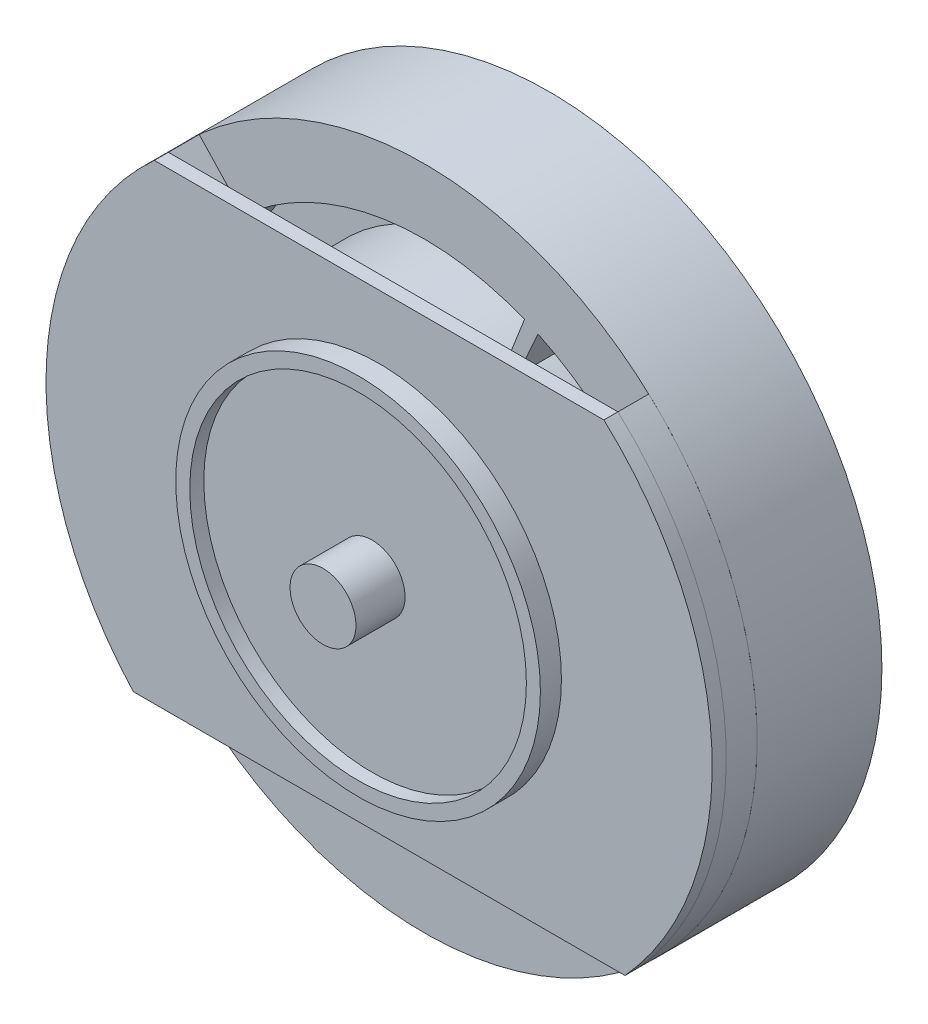
ISO-10303-21;
HEADER;
FILE_DESCRIPTION(('STEP AP214'),'2;1');
FILE_NAME('part.step','',(''),(''),'','','');
FILE_SCHEMA(('AUTOMOTIVE_DESIGN { 1 0 10303 214 1 1 1 1 }'));
ENDSEC;
DATA;
#1=APPLICATION_CONTEXT('core data for automotive mechanical design processes');
#2=APPLICATION_PROTOCOL_DEFINITION('international standard','automotive_design',2000,#1);
#3=PRODUCT_CONTEXT('',#1,'mechanical');
#4=PRODUCT('Part','Part','',(#3));
#5=PRODUCT_RELATED_PRODUCT_CATEGORY('part','',(#4));
#6=PRODUCT_DEFINITION_FORMATION('','',#4);
#7=PRODUCT_DEFINITION_CONTEXT('part definition',#1,'design');
#8=PRODUCT_DEFINITION('design','',#6,#7);
#9=PRODUCT_DEFINITION_SHAPE('','',#8);
#10=(LENGTH_UNIT() NAMED_UNIT(*) SI_UNIT(.MILLI.,.METRE.));
#11=(NAMED_UNIT(*) PLANE_ANGLE_UNIT() SI_UNIT($,.RADIAN.));
#12=(NAMED_UNIT(*) SI_UNIT($,.STERADIAN.) SOLID_ANGLE_UNIT());
#13=UNCERTAINTY_MEASURE_WITH_UNIT(LENGTH_MEASURE(1.E-05),#10,'distance_accuracy_value','');
#14=(GEOMETRIC_REPRESENTATION_CONTEXT(3) GLOBAL_UNCERTAINTY_ASSIGNED_CONTEXT((#13)) GLOBAL_UNIT_ASSIGNED_CONTEXT((#10,
#11,#12)) REPRESENTATION_CONTEXT('',''));
#15=CARTESIAN_POINT('',(0.,0.,0.));
#16=DIRECTION('',(0.,0.,1.));
#17=DIRECTION('',(1.,0.,0.));
#18=AXIS2_PLACEMENT_3D('',#15,#16,#17);
#19=CARTESIAN_POINT('',(-3.82843024285123,2.76033441316249,12.2448799994286));
#20=DIRECTION('',(0.,0.,-1.));
#21=DIRECTION('',(-1.,0.,0.));
#22=AXIS2_PLACEMENT_3D('',#19,#20,#21);
#23=CYLINDRICAL_SURFACE('',#22,23.75);
#24=CARTESIAN_POINT('',(-3.82843024285123,2.76033441316249,11.2448799994286));
#25=DIRECTION('',(0.,0.,1.));
#26=DIRECTION('',(1.,0.,0.));
#27=AXIS2_PLACEMENT_3D('',#24,#25,#26);
#28=CIRCLE('',#27,23.75);
#29=CARTESIAN_POINT('',(-19.8553375945632,20.2874773845552,11.2448799994286));
#30=VERTEX_POINT('',#29);
#31=CARTESIAN_POINT('',(-21.355573214244,-13.2665729385494,11.2448799994286));
#32=VERTEX_POINT('',#31);
#33=EDGE_CURVE('E128',#30,#32,#28,.T.);
#34=ORIENTED_EDGE('',*,*,#33,.T.);
#35=DIRECTION('',(0.,0.,-1.));
#36=VECTOR('',#35,1.);
#37=CARTESIAN_POINT('',(-21.355573214244,-13.2665729385494,12.2448799994286));
#38=LINE('',#37,#36);
#39=CARTESIAN_POINT('',(-21.355573214244,-13.2665729385494,12.2448799994286));
#40=VERTEX_POINT('',#39);
#41=EDGE_CURVE('E12',#40,#32,#38,.T.);
#42=ORIENTED_EDGE('',*,*,#41,.F.);
#43=CARTESIAN_POINT('',(-3.82843024285123,2.76033441316249,12.2448799994286));
#44=DIRECTION('',(0.,0.,1.));
#45=DIRECTION('',(1.,0.,0.));
#46=AXIS2_PLACEMENT_3D('',#43,#44,#45);
#47=CIRCLE('',#46,23.75);
#48=CARTESIAN_POINT('',(-19.8553375945632,20.2874773845552,12.2448799994286));
#49=VERTEX_POINT('',#48);
#50=EDGE_CURVE('E111',#49,#40,#47,.T.);
#51=ORIENTED_EDGE('',*,*,#50,.F.);
#52=DIRECTION('',(0.,0.,-1.));
#53=VECTOR('',#52,1.);
#54=CARTESIAN_POINT('',(-19.8553375945632,20.2874773845552,12.2448799994286));
#55=LINE('',#54,#53);
#56=EDGE_CURVE('E124',#49,#30,#55,.T.);
#57=ORIENTED_EDGE('',*,*,#56,.T.);
#58=EDGE_LOOP('',(#34,#42,#51,#57));
#59=FACE_BOUND('',#58,.T.);
#60=ADVANCED_FACE('F58',(#59),#23,.T.);
#61=CARTESIAN_POINT('',(-21.355573214244,-13.2665729385494,12.2448799994286));
#62=DIRECTION('',(0.,1.,0.));
#63=DIRECTION('',(0.,0.,1.));
#64=AXIS2_PLACEMENT_3D('',#61,#62,#63);
#65=PLANE('',#64);
#66=DIRECTION('',(1.,0.,0.));
#67=VECTOR('',#66,1.);
#68=CARTESIAN_POINT('',(-21.355573214244,-13.2665729385494,11.2448799994286));
#69=LINE('',#68,#67);
#70=CARTESIAN_POINT('',(13.6987127285415,-13.2665729385494,11.2448799994286));
#71=VERTEX_POINT('',#70);
#72=EDGE_CURVE('E116',#32,#71,#69,.T.);
#73=ORIENTED_EDGE('',*,*,#72,.T.);
#74=DIRECTION('',(0.,0.,-1.));
#75=VECTOR('',#74,1.);
#76=CARTESIAN_POINT('',(13.6987127285415,-13.2665729385494,12.2448799994286));
#77=LINE('',#76,#75);
#78=CARTESIAN_POINT('',(13.6987127285415,-13.2665729385494,12.2448799994286));
#79=VERTEX_POINT('',#78);
#80=EDGE_CURVE('E68',#79,#71,#77,.T.);
#81=ORIENTED_EDGE('',*,*,#80,.F.);
#82=DIRECTION('',(1.,0.,0.));
#83=VECTOR('',#82,1.);
#84=CARTESIAN_POINT('',(-21.355573214244,-13.2665729385494,12.2448799994286));
#85=LINE('',#84,#83);
#86=EDGE_CURVE('E106',#40,#79,#85,.T.);
#87=ORIENTED_EDGE('',*,*,#86,.F.);
#88=ORIENTED_EDGE('',*,*,#41,.T.);
#89=EDGE_LOOP('',(#73,#81,#87,#88));
#90=FACE_BOUND('',#89,.T.);
#91=ADVANCED_FACE('F115',(#90),#65,.F.);
#92=CARTESIAN_POINT('',(-3.82843024285123,2.76033441316249,12.2448799994286));
#93=DIRECTION('',(0.,0.,-1.));
#94=DIRECTION('',(-1.,0.,0.));
#95=AXIS2_PLACEMENT_3D('',#92,#93,#94);
#96=CYLINDRICAL_SURFACE('',#95,23.75);
#97=CARTESIAN_POINT('',(-3.82843024285123,2.76033441316249,11.2448799994286));
#98=DIRECTION('',(0.,0.,1.));
#99=DIRECTION('',(-1.,0.,0.));
#100=AXIS2_PLACEMENT_3D('',#97,#98,#99);
#101=CIRCLE('',#100,23.75);
#102=CARTESIAN_POINT('',(12.1984771088607,20.2874773845552,11.2448799994286));
#103=VERTEX_POINT('',#102);
#104=EDGE_CURVE('E93',#71,#103,#101,.T.);
#105=ORIENTED_EDGE('',*,*,#104,.T.);
#106=DIRECTION('',(0.,0.,-1.));
#107=VECTOR('',#106,1.);
#108=CARTESIAN_POINT('',(12.1984771088607,20.2874773845552,12.2448799994286));
#109=LINE('',#108,#107);
#110=CARTESIAN_POINT('',(12.1984771088607,20.2874773845552,12.2448799994286));
#111=VERTEX_POINT('',#110);
#112=EDGE_CURVE('E118',#111,#103,#109,.T.);
#113=ORIENTED_EDGE('',*,*,#112,.F.);
#114=CARTESIAN_POINT('',(-3.82843024285123,2.76033441316249,12.2448799994286));
#115=DIRECTION('',(0.,0.,1.));
#116=DIRECTION('',(-1.,0.,0.));
#117=AXIS2_PLACEMENT_3D('',#114,#115,#116);
#118=CIRCLE('',#117,23.75);
#119=EDGE_CURVE('E109',#79,#111,#118,.T.);
#120=ORIENTED_EDGE('',*,*,#119,.F.);
#121=ORIENTED_EDGE('',*,*,#80,.T.);
#122=EDGE_LOOP('',(#105,#113,#120,#121));
#123=FACE_BOUND('',#122,.T.);
#124=ADVANCED_FACE('F120',(#123),#96,.T.);
#125=CARTESIAN_POINT('',(-19.8553375945632,20.2874773845552,12.2448799994286));
#126=DIRECTION('',(0.,-1.,0.));
#127=DIRECTION('',(0.,0.,-1.));
#128=AXIS2_PLACEMENT_3D('',#125,#126,#127);
#129=PLANE('',#128);
#130=DIRECTION('',(-1.,0.,0.));
#131=VECTOR('',#130,1.);
#132=CARTESIAN_POINT('',(-19.8553375945632,20.2874773845552,11.2448799994286));
#133=LINE('',#132,#131);
#134=EDGE_CURVE('E99',#103,#30,#133,.T.);
#135=ORIENTED_EDGE('',*,*,#134,.T.);
#136=ORIENTED_EDGE('',*,*,#56,.F.);
#137=DIRECTION('',(-1.,0.,0.));
#138=VECTOR('',#137,1.);
#139=CARTESIAN_POINT('',(-19.8553375945632,20.2874773845552,12.2448799994286));
#140=LINE('',#139,#138);
#141=EDGE_CURVE('E76',#111,#49,#140,.T.);
#142=ORIENTED_EDGE('',*,*,#141,.F.);
#143=ORIENTED_EDGE('',*,*,#112,.T.);
#144=EDGE_LOOP('',(#135,#136,#142,#143));
#145=FACE_BOUND('',#144,.T.);
#146=ADVANCED_FACE('F142',(#145),#129,.F.);
#147=CARTESIAN_POINT('',(-3.82843024285123,2.76033441316249,12.2448799994286));
#148=DIRECTION('',(0.,0.,1.));
#149=DIRECTION('',(1.,0.,0.));
#150=AXIS2_PLACEMENT_3D('',#147,#148,#149);
#151=PLANE('',#150);
#152=CARTESIAN_POINT('',(-3.82843024285123,2.76033441316249,12.2448799994286));
#153=DIRECTION('',(0.,0.,1.));
#154=DIRECTION('',(1.,0.,0.));
#155=AXIS2_PLACEMENT_3D('',#152,#153,#154);
#156=CIRCLE('',#155,13.);
#157=CARTESIAN_POINT('',(9.17156975714877,2.76033441316249,12.2448799994286));
#158=VERTEX_POINT('',#157);
#159=EDGE_CURVE('E152',#158,#158,#156,.T.);
#160=ORIENTED_EDGE('',*,*,#159,.F.);
#161=EDGE_LOOP('',(#160));
#162=FACE_BOUND('',#161,.T.);
#163=ORIENTED_EDGE('',*,*,#50,.T.);
#164=ORIENTED_EDGE('',*,*,#86,.T.);
#165=ORIENTED_EDGE('',*,*,#119,.T.);
#166=ORIENTED_EDGE('',*,*,#141,.T.);
#167=EDGE_LOOP('',(#163,#164,#165,#166));
#168=FACE_BOUND('',#167,.T.);
#169=ADVANCED_FACE('F107',(#162,#168),#151,.T.);
#170=CARTESIAN_POINT('',(-3.82843024285123,2.76033441316249,11.2448799994286));
#171=DIRECTION('',(0.,0.,1.));
#172=DIRECTION('',(1.,0.,0.));
#173=AXIS2_PLACEMENT_3D('',#170,#171,#172);
#174=PLANE('',#173);
#175=ORIENTED_EDGE('',*,*,#33,.F.);
#176=ORIENTED_EDGE('',*,*,#134,.F.);
#177=ORIENTED_EDGE('',*,*,#104,.F.);
#178=ORIENTED_EDGE('',*,*,#72,.F.);
#179=EDGE_LOOP('',(#175,#176,#177,#178));
#180=FACE_BOUND('',#179,.T.);
#181=ADVANCED_FACE('F145',(#180),#174,.F.);
#182=CARTESIAN_POINT('',(-3.82843024285123,2.76033441316249,13.7448799994286));
#183=DIRECTION('',(0.,0.,-1.));
#184=DIRECTION('',(-1.,0.,0.));
#185=AXIS2_PLACEMENT_3D('',#182,#183,#184);
#186=CYLINDRICAL_SURFACE('',#185,13.);
#187=CARTESIAN_POINT('',(-3.82843024285123,2.76033441316249,13.7448799994286));
#188=DIRECTION('',(0.,0.,1.));
#189=DIRECTION('',(1.,0.,0.));
#190=AXIS2_PLACEMENT_3D('',#187,#188,#189);
#191=CIRCLE('',#190,13.);
#192=CARTESIAN_POINT('',(9.17156975714877,2.76033441316249,13.7448799994286));
#193=VERTEX_POINT('',#192);
#194=EDGE_CURVE('E156',#193,#193,#191,.T.);
#195=ORIENTED_EDGE('',*,*,#194,.F.);
#196=EDGE_LOOP('',(#195));
#197=FACE_BOUND('',#196,.T.);
#198=ORIENTED_EDGE('',*,*,#159,.T.);
#199=EDGE_LOOP('',(#198));
#200=FACE_BOUND('',#199,.T.);
#201=ADVANCED_FACE('F180',(#197,#200),#186,.T.);
#202=CARTESIAN_POINT('',(-3.82843024285123,2.76033441316249,13.7448799994286));
#203=DIRECTION('',(0.,0.,1.));
#204=DIRECTION('',(1.,0.,0.));
#205=AXIS2_PLACEMENT_3D('',#202,#203,#204);
#206=PLANE('',#205);
#207=CARTESIAN_POINT('',(-3.82843024285123,2.76033441316249,13.7448799994286));
#208=DIRECTION('',(0.,0.,1.));
#209=DIRECTION('',(1.,0.,0.));
#210=AXIS2_PLACEMENT_3D('',#207,#208,#209);
#211=CIRCLE('',#210,12.);
#212=CARTESIAN_POINT('',(8.17156975714877,2.76033441316249,13.7448799994286));
#213=VERTEX_POINT('',#212);
#214=EDGE_CURVE('E161',#213,#213,#211,.T.);
#215=ORIENTED_EDGE('',*,*,#214,.F.);
#216=EDGE_LOOP('',(#215));
#217=FACE_BOUND('',#216,.T.);
#218=ORIENTED_EDGE('',*,*,#194,.T.);
#219=EDGE_LOOP('',(#218));
#220=FACE_BOUND('',#219,.T.);
#221=ADVANCED_FACE('F174',(#217,#220),#206,.T.);
#222=CARTESIAN_POINT('',(-3.82843024285123,2.76033441316249,12.7448799994286));
#223=DIRECTION('',(0.,0.,1.));
#224=DIRECTION('',(1.,0.,0.));
#225=AXIS2_PLACEMENT_3D('',#222,#223,#224);
#226=CYLINDRICAL_SURFACE('',#225,12.);
#227=CARTESIAN_POINT('',(-3.82843024285123,2.76033441316249,12.7448799994286));
#228=DIRECTION('',(0.,0.,1.));
#229=DIRECTION('',(1.,0.,0.));
#230=AXIS2_PLACEMENT_3D('',#227,#228,#229);
#231=CIRCLE('',#230,12.);
#232=CARTESIAN_POINT('',(8.17156975714877,2.76033441316249,12.7448799994286));
#233=VERTEX_POINT('',#232);
#234=EDGE_CURVE('E157',#233,#233,#231,.T.);
#235=ORIENTED_EDGE('',*,*,#234,.F.);
#236=EDGE_LOOP('',(#235));
#237=FACE_BOUND('',#236,.T.);
#238=ORIENTED_EDGE('',*,*,#214,.T.);
#239=EDGE_LOOP('',(#238));
#240=FACE_BOUND('',#239,.T.);
#241=ADVANCED_FACE('F171',(#237,#240),#226,.F.);
#242=CARTESIAN_POINT('',(-3.82843024285123,2.76033441316249,12.7448799994286));
#243=DIRECTION('',(0.,0.,1.));
#244=DIRECTION('',(1.,0.,0.));
#245=AXIS2_PLACEMENT_3D('',#242,#243,#244);
#246=PLANE('',#245);
#247=CARTESIAN_POINT('',(-3.82843024285123,2.76033441316249,12.7448799994286));
#248=DIRECTION('',(0.,0.,1.));
#249=DIRECTION('',(1.,0.,0.));
#250=AXIS2_PLACEMENT_3D('',#247,#248,#249);
#251=CIRCLE('',#250,2.35);
#252=CARTESIAN_POINT('',(-1.47843024285123,2.76033441316249,12.7448799994286));
#253=VERTEX_POINT('',#252);
#254=EDGE_CURVE('E61',#253,#253,#251,.T.);
#255=ORIENTED_EDGE('',*,*,#254,.F.);
#256=EDGE_LOOP('',(#255));
#257=FACE_BOUND('',#256,.T.);
#258=ORIENTED_EDGE('',*,*,#234,.T.);
#259=EDGE_LOOP('',(#258));
#260=FACE_BOUND('',#259,.T.);
#261=ADVANCED_FACE('F169',(#257,#260),#246,.T.);
#262=CARTESIAN_POINT('',(-3.82843024285123,2.76033441316249,16.2448799994286));
#263=DIRECTION('',(0.,0.,1.));
#264=DIRECTION('',(1.,0.,0.));
#265=AXIS2_PLACEMENT_3D('',#262,#263,#264);
#266=PLANE('',#265);
#267=CARTESIAN_POINT('',(-3.82843024285123,2.76033441316249,16.2448799994286));
#268=DIRECTION('',(0.,0.,1.));
#269=DIRECTION('',(1.,0.,0.));
#270=AXIS2_PLACEMENT_3D('',#267,#268,#269);
#271=CIRCLE('',#270,2.35);
#272=CARTESIAN_POINT('',(-1.47843024285123,2.76033441316249,16.2448799994286));
#273=VERTEX_POINT('',#272);
#274=EDGE_CURVE('E132',#273,#273,#271,.T.);
#275=ORIENTED_EDGE('',*,*,#274,.T.);
#276=EDGE_LOOP('',(#275));
#277=FACE_BOUND('',#276,.T.);
#278=ADVANCED_FACE('F252',(#277),#266,.T.);
#279=CARTESIAN_POINT('',(-3.82843024285123,2.76033441316249,16.2448799994286));
#280=DIRECTION('',(0.,0.,-1.));
#281=DIRECTION('',(-1.,0.,0.));
#282=AXIS2_PLACEMENT_3D('',#279,#280,#281);
#283=CYLINDRICAL_SURFACE('',#282,2.35);
#284=ORIENTED_EDGE('',*,*,#254,.T.);
#285=EDGE_LOOP('',(#284));
#286=FACE_BOUND('',#285,.T.);
#287=ORIENTED_EDGE('',*,*,#274,.F.);
#288=EDGE_LOOP('',(#287));
#289=FACE_BOUND('',#288,.T.);
#290=ADVANCED_FACE('F263',(#286,#289),#283,.T.);
#291=CLOSED_SHELL('',(#60,#91,#124,#146,#169,#181,#201,#221,#241,#261,#278,#290));
#292=MANIFOLD_SOLID_BREP('B2',#291);
#293=CARTESIAN_POINT('',(-3.82843024285123,2.76033441316249,9.04487999942864));
#294=DIRECTION('',(0.,0.,1.));
#295=DIRECTION('',(1.,0.,0.));
#296=AXIS2_PLACEMENT_3D('',#293,#294,#295);
#297=PLANE('',#296);
#298=CARTESIAN_POINT('',(-3.82843024285123,2.76033441316249,9.04487999942864));
#299=DIRECTION('',(0.,0.,-1.));
#300=DIRECTION('',(1.,0.,0.));
#301=AXIS2_PLACEMENT_3D('',#298,#299,#300);
#302=CIRCLE('',#301,19.1);
#303=CARTESIAN_POINT('',(-17.9579810626889,-10.0913500534599,9.04487999942864));
#304=VERTEX_POINT('',#303);
#305=CARTESIAN_POINT('',(-16.6801147094736,16.8898852330002,9.04487999942864));
#306=VERTEX_POINT('',#305);
#307=EDGE_CURVE('E56',#304,#306,#302,.T.);
#308=ORIENTED_EDGE('',*,*,#307,.F.);
#309=DIRECTION('',(0.730611377314205,0.682793537856825,0.));
#310=VECTOR('',#309,1.);
#311=CARTESIAN_POINT('',(-21.355573214244,-13.2665729385494,9.04487999942864));
#312=LINE('',#311,#310);
#313=CARTESIAN_POINT('',(-21.355573214244,-13.2665729385494,9.04487999942864));
#314=VERTEX_POINT('',#313);
#315=EDGE_CURVE('E387',#314,#304,#312,.T.);
#316=ORIENTED_EDGE('',*,*,#315,.F.);
#317=CARTESIAN_POINT('',(-3.82843024285123,2.76033441316249,9.04487999942864));
#318=DIRECTION('',(0.,0.,1.));
#319=DIRECTION('',(1.,0.,0.));
#320=AXIS2_PLACEMENT_3D('',#317,#318,#319);
#321=CIRCLE('',#320,23.75);
#322=CARTESIAN_POINT('',(-19.8553375945632,20.2874773845552,9.04487999942864));
#323=VERTEX_POINT('',#322);
#324=EDGE_CURVE('E390',#323,#314,#321,.T.);
#325=ORIENTED_EDGE('',*,*,#324,.F.);
#326=DIRECTION('',(-0.682793537856825,0.730611377314205,0.));
#327=VECTOR('',#326,1.);
#328=CARTESIAN_POINT('',(-16.6801147094736,16.8898852330002,9.04487999942864));
#329=LINE('',#328,#327);
#330=EDGE_CURVE('E333',#306,#323,#329,.T.);
#331=ORIENTED_EDGE('',*,*,#330,.F.);
#332=EDGE_LOOP('',(#308,#316,#325,#331));
#333=FACE_BOUND('',#332,.T.);
#334=ADVANCED_FACE('F324',(#333),#297,.F.);
#335=CARTESIAN_POINT('',(-21.355573214244,-13.2665729385494,47.2244431281084));
#336=DIRECTION('',(-0.682793537856825,0.730611377314205,0.));
#337=DIRECTION('',(-0.730611377314205,-0.682793537856825,0.));
#338=AXIS2_PLACEMENT_3D('',#335,#336,#337);
#339=PLANE('',#338);
#340=DIRECTION('',(0.,0.,-1.));
#341=VECTOR('',#340,1.);
#342=CARTESIAN_POINT('',(-17.9579810626889,-10.0913500534599,47.2244431281084));
#343=LINE('',#342,#341);
#344=CARTESIAN_POINT('',(-17.9579810626889,-10.0913500534599,11.2448799994286));
#345=VERTEX_POINT('',#344);
#346=EDGE_CURVE('E385',#345,#304,#343,.T.);
#347=ORIENTED_EDGE('',*,*,#346,.F.);
#348=DIRECTION('',(-0.730611377314205,-0.682793537856825,0.));
#349=VECTOR('',#348,1.);
#350=CARTESIAN_POINT('',(-21.355573214244,-13.2665729385494,11.2448799994286));
#351=LINE('',#350,#349);
#352=CARTESIAN_POINT('',(-21.355573214244,-13.2665729385494,11.2448799994286));
#353=VERTEX_POINT('',#352);
#354=EDGE_CURVE('E378',#345,#353,#351,.T.);
#355=ORIENTED_EDGE('',*,*,#354,.T.);
#356=DIRECTION('',(0.,0.,-1.));
#357=VECTOR('',#356,1.);
#358=CARTESIAN_POINT('',(-21.355573214244,-13.2665729385494,47.2244431281084));
#359=LINE('',#358,#357);
#360=EDGE_CURVE('E374',#353,#314,#359,.T.);
#361=ORIENTED_EDGE('',*,*,#360,.T.);
#362=ORIENTED_EDGE('',*,*,#315,.T.);
#363=EDGE_LOOP('',(#347,#355,#361,#362));
#364=FACE_BOUND('',#363,.T.);
#365=ADVANCED_FACE('F395',(#364),#339,.F.);
#366=CARTESIAN_POINT('',(-3.82843024285123,2.76033441316249,47.2244431281084));
#367=DIRECTION('',(0.,0.,-1.));
#368=DIRECTION('',(-1.,0.,0.));
#369=AXIS2_PLACEMENT_3D('',#366,#367,#368);
#370=CYLINDRICAL_SURFACE('',#369,23.75);
#371=ORIENTED_EDGE('',*,*,#360,.F.);
#372=CARTESIAN_POINT('',(-3.82843024285123,2.76033441316249,11.2448799994286));
#373=DIRECTION('',(0.,0.,-1.));
#374=DIRECTION('',(-1.,0.,0.));
#375=AXIS2_PLACEMENT_3D('',#372,#373,#374);
#376=CIRCLE('',#375,23.75);
#377=CARTESIAN_POINT('',(-19.8553375945632,20.2874773845552,11.2448799994286));
#378=VERTEX_POINT('',#377);
#379=EDGE_CURVE('E328',#353,#378,#376,.T.);
#380=ORIENTED_EDGE('',*,*,#379,.T.);
#381=DIRECTION('',(0.,0.,-1.));
#382=VECTOR('',#381,1.);
#383=CARTESIAN_POINT('',(-19.8553375945632,20.2874773845552,47.2244431281084));
#384=LINE('',#383,#382);
#385=EDGE_CURVE('E349',#378,#323,#384,.T.);
#386=ORIENTED_EDGE('',*,*,#385,.T.);
#387=ORIENTED_EDGE('',*,*,#324,.T.);
#388=EDGE_LOOP('',(#371,#380,#386,#387));
#389=FACE_BOUND('',#388,.T.);
#390=ADVANCED_FACE('F376',(#389),#370,.T.);
#391=CARTESIAN_POINT('',(-16.6801147094736,16.8898852330002,47.2244431281084));
#392=DIRECTION('',(-0.730611377314205,-0.682793537856825,0.));
#393=DIRECTION('',(0.682793537856825,-0.730611377314205,0.));
#394=AXIS2_PLACEMENT_3D('',#391,#392,#393);
#395=PLANE('',#394);
#396=ORIENTED_EDGE('',*,*,#385,.F.);
#397=DIRECTION('',(0.682793537856825,-0.730611377314205,0.));
#398=VECTOR('',#397,1.);
#399=CARTESIAN_POINT('',(-16.6801147094736,16.8898852330002,11.2448799994286));
#400=LINE('',#399,#398);
#401=CARTESIAN_POINT('',(-16.6801147094736,16.8898852330002,11.2448799994286));
#402=VERTEX_POINT('',#401);
#403=EDGE_CURVE('E368',#378,#402,#400,.T.);
#404=ORIENTED_EDGE('',*,*,#403,.T.);
#405=DIRECTION('',(0.,0.,-1.));
#406=VECTOR('',#405,1.);
#407=CARTESIAN_POINT('',(-16.6801147094736,16.8898852330002,47.2244431281084));
#408=LINE('',#407,#406);
#409=EDGE_CURVE('E341',#402,#306,#408,.T.);
#410=ORIENTED_EDGE('',*,*,#409,.T.);
#411=ORIENTED_EDGE('',*,*,#330,.T.);
#412=EDGE_LOOP('',(#396,#404,#410,#411));
#413=FACE_BOUND('',#412,.T.);
#414=ADVANCED_FACE('F372',(#413),#395,.F.);
#415=CARTESIAN_POINT('',(-3.82843024285123,2.76033441316249,47.2244431281084));
#416=DIRECTION('',(0.,0.,-1.));
#417=DIRECTION('',(-1.,0.,0.));
#418=AXIS2_PLACEMENT_3D('',#415,#416,#417);
#419=CYLINDRICAL_SURFACE('',#418,19.1);
#420=ORIENTED_EDGE('',*,*,#409,.F.);
#421=CARTESIAN_POINT('',(-3.82843024285123,2.76033441316249,11.2448799994286));
#422=DIRECTION('',(0.,0.,-1.));
#423=DIRECTION('',(-1.,0.,0.));
#424=AXIS2_PLACEMENT_3D('',#421,#422,#423);
#425=CIRCLE('',#424,19.1);
#426=EDGE_CURVE('E371',#402,#345,#425,.F.);
#427=ORIENTED_EDGE('',*,*,#426,.T.);
#428=ORIENTED_EDGE('',*,*,#346,.T.);
#429=ORIENTED_EDGE('',*,*,#307,.T.);
#430=EDGE_LOOP('',(#420,#427,#428,#429));
#431=FACE_BOUND('',#430,.T.);
#432=ADVANCED_FACE('F394',(#431),#419,.F.);
#433=CARTESIAN_POINT('',(-3.82843024285123,2.76033441316249,11.2448799994286));
#434=DIRECTION('',(0.,0.,-1.));
#435=DIRECTION('',(-1.,0.,0.));
#436=AXIS2_PLACEMENT_3D('',#433,#434,#435);
#437=PLANE('',#436);
#438=ORIENTED_EDGE('',*,*,#403,.F.);
#439=ORIENTED_EDGE('',*,*,#379,.F.);
#440=ORIENTED_EDGE('',*,*,#354,.F.);
#441=ORIENTED_EDGE('',*,*,#426,.F.);
#442=EDGE_LOOP('',(#438,#439,#440,#441));
#443=FACE_BOUND('',#442,.T.);
#444=ADVANCED_FACE('F326',(#443),#437,.F.);
#445=CLOSED_SHELL('',(#334,#365,#390,#414,#432,#444));
#446=MANIFOLD_SOLID_BREP('B6',#445);
#447=CARTESIAN_POINT('',(-3.82843024285123,2.76033441316249,9.04487999942864));
#448=DIRECTION('',(0.,0.,-1.));
#449=DIRECTION('',(-1.,0.,0.));
#450=AXIS2_PLACEMENT_3D('',#447,#448,#449);
#451=PLANE('',#450);
#452=CARTESIAN_POINT('',(-3.82843024285123,2.76033441316249,9.04487999942864));
#453=DIRECTION('',(0.,0.,-1.));
#454=DIRECTION('',(-1.,0.,0.));
#455=AXIS2_PLACEMENT_3D('',#452,#453,#454);
#456=CIRCLE('',#455,19.1);
#457=CARTESIAN_POINT('',(9.02325422377115,16.8898852330002,9.04487999942864));
#458=VERTEX_POINT('',#457);
#459=CARTESIAN_POINT('',(10.3011205769865,-10.0913500534599,9.04487999942864));
#460=VERTEX_POINT('',#459);
#461=EDGE_CURVE('E520',#458,#460,#456,.T.);
#462=ORIENTED_EDGE('',*,*,#461,.F.);
#463=DIRECTION('',(-0.682793537856827,-0.730611377314204,0.));
#464=VECTOR('',#463,1.);
#465=CARTESIAN_POINT('',(9.02325422377115,16.8898852330002,9.04487999942864));
#466=LINE('',#465,#464);
#467=CARTESIAN_POINT('',(12.1984771088607,20.2874773845552,9.04487999942864));
#468=VERTEX_POINT('',#467);
#469=EDGE_CURVE('E531',#468,#458,#466,.T.);
#470=ORIENTED_EDGE('',*,*,#469,.F.);
#471=CARTESIAN_POINT('',(-3.82843024285123,2.76033441316249,9.04487999942864));
#472=DIRECTION('',(0.,0.,1.));
#473=DIRECTION('',(1.,0.,0.));
#474=AXIS2_PLACEMENT_3D('',#471,#472,#473);
#475=CIRCLE('',#474,23.75);
#476=CARTESIAN_POINT('',(13.6987127285415,-13.2665729385494,9.04487999942864));
#477=VERTEX_POINT('',#476);
#478=EDGE_CURVE('E522',#477,#468,#475,.T.);
#479=ORIENTED_EDGE('',*,*,#478,.F.);
#480=DIRECTION('',(0.730611377314204,-0.682793537856827,0.));
#481=VECTOR('',#480,1.);
#482=CARTESIAN_POINT('',(13.6987127285415,-13.2665729385494,9.04487999942864));
#483=LINE('',#482,#481);
#484=EDGE_CURVE('E512',#460,#477,#483,.T.);
#485=ORIENTED_EDGE('',*,*,#484,.F.);
#486=EDGE_LOOP('',(#462,#470,#479,#485));
#487=FACE_BOUND('',#486,.T.);
#488=ADVANCED_FACE('F470',(#487),#451,.T.);
#489=CARTESIAN_POINT('',(9.02325422377115,16.8898852330002,47.2244431281084));
#490=DIRECTION('',(0.730611377314204,-0.682793537856827,0.));
#491=DIRECTION('',(0.682793537856827,0.730611377314204,0.));
#492=AXIS2_PLACEMENT_3D('',#489,#490,#491);
#493=PLANE('',#492);
#494=DIRECTION('',(0.,0.,-1.));
#495=VECTOR('',#494,1.);
#496=CARTESIAN_POINT('',(9.02325422377115,16.8898852330002,47.2244431281084));
#497=LINE('',#496,#495);
#498=CARTESIAN_POINT('',(9.02325422377115,16.8898852330002,11.2448799994286));
#499=VERTEX_POINT('',#498);
#500=EDGE_CURVE('E525',#499,#458,#497,.T.);
#501=ORIENTED_EDGE('',*,*,#500,.F.);
#502=DIRECTION('',(0.682793537856827,0.730611377314204,0.));
#503=VECTOR('',#502,1.);
#504=CARTESIAN_POINT('',(9.02325422377115,16.8898852330002,11.2448799994286));
#505=LINE('',#504,#503);
#506=CARTESIAN_POINT('',(12.1984771088607,20.2874773845552,11.2448799994286));
#507=VERTEX_POINT('',#506);
#508=EDGE_CURVE('E474',#499,#507,#505,.T.);
#509=ORIENTED_EDGE('',*,*,#508,.T.);
#510=DIRECTION('',(0.,0.,-1.));
#511=VECTOR('',#510,1.);
#512=CARTESIAN_POINT('',(12.1984771088607,20.2874773845552,47.2244431281084));
#513=LINE('',#512,#511);
#514=EDGE_CURVE('E534',#507,#468,#513,.T.);
#515=ORIENTED_EDGE('',*,*,#514,.T.);
#516=ORIENTED_EDGE('',*,*,#469,.T.);
#517=EDGE_LOOP('',(#501,#509,#515,#516));
#518=FACE_BOUND('',#517,.T.);
#519=ADVANCED_FACE('F543',(#518),#493,.F.);
#520=CARTESIAN_POINT('',(-3.82843024285123,2.76033441316249,47.2244431281084));
#521=DIRECTION('',(0.,0.,-1.));
#522=DIRECTION('',(-1.,0.,0.));
#523=AXIS2_PLACEMENT_3D('',#520,#521,#522);
#524=CYLINDRICAL_SURFACE('',#523,23.75);
#525=ORIENTED_EDGE('',*,*,#514,.F.);
#526=CARTESIAN_POINT('',(-3.82843024285123,2.76033441316249,11.2448799994286));
#527=DIRECTION('',(0.,0.,-1.));
#528=DIRECTION('',(-1.,0.,0.));
#529=AXIS2_PLACEMENT_3D('',#526,#527,#528);
#530=CIRCLE('',#529,23.75);
#531=CARTESIAN_POINT('',(13.6987127285415,-13.2665729385494,11.2448799994286));
#532=VERTEX_POINT('',#531);
#533=EDGE_CURVE('E540',#507,#532,#530,.T.);
#534=ORIENTED_EDGE('',*,*,#533,.T.);
#535=DIRECTION('',(0.,0.,-1.));
#536=VECTOR('',#535,1.);
#537=CARTESIAN_POINT('',(13.6987127285415,-13.2665729385494,47.2244431281084));
#538=LINE('',#537,#536);
#539=EDGE_CURVE('E516',#532,#477,#538,.T.);
#540=ORIENTED_EDGE('',*,*,#539,.T.);
#541=ORIENTED_EDGE('',*,*,#478,.T.);
#542=EDGE_LOOP('',(#525,#534,#540,#541));
#543=FACE_BOUND('',#542,.T.);
#544=ADVANCED_FACE('F539',(#543),#524,.T.);
#545=CARTESIAN_POINT('',(13.6987127285415,-13.2665729385494,47.2244431281084));
#546=DIRECTION('',(0.682793537856827,0.730611377314204,0.));
#547=DIRECTION('',(-0.730611377314204,0.682793537856827,0.));
#548=AXIS2_PLACEMENT_3D('',#545,#546,#547);
#549=PLANE('',#548);
#550=ORIENTED_EDGE('',*,*,#539,.F.);
#551=DIRECTION('',(-0.730611377314204,0.682793537856827,0.));
#552=VECTOR('',#551,1.);
#553=CARTESIAN_POINT('',(13.6987127285415,-13.2665729385494,11.2448799994286));
#554=LINE('',#553,#552);
#555=CARTESIAN_POINT('',(10.3011205769865,-10.0913500534599,11.2448799994286));
#556=VERTEX_POINT('',#555);
#557=EDGE_CURVE('E479',#532,#556,#554,.T.);
#558=ORIENTED_EDGE('',*,*,#557,.T.);
#559=DIRECTION('',(0.,0.,-1.));
#560=VECTOR('',#559,1.);
#561=CARTESIAN_POINT('',(10.3011205769865,-10.0913500534599,47.2244431281084));
#562=LINE('',#561,#560);
#563=EDGE_CURVE('E509',#556,#460,#562,.T.);
#564=ORIENTED_EDGE('',*,*,#563,.T.);
#565=ORIENTED_EDGE('',*,*,#484,.T.);
#566=EDGE_LOOP('',(#550,#558,#564,#565));
#567=FACE_BOUND('',#566,.T.);
#568=ADVANCED_FACE('F511',(#567),#549,.F.);
#569=CARTESIAN_POINT('',(-3.82843024285123,2.76033441316249,47.2244431281084));
#570=DIRECTION('',(0.,0.,-1.));
#571=DIRECTION('',(-1.,0.,0.));
#572=AXIS2_PLACEMENT_3D('',#569,#570,#571);
#573=CYLINDRICAL_SURFACE('',#572,19.1);
#574=ORIENTED_EDGE('',*,*,#563,.F.);
#575=CARTESIAN_POINT('',(-3.82843024285123,2.76033441316249,11.2448799994286));
#576=DIRECTION('',(0.,0.,-1.));
#577=DIRECTION('',(-1.,0.,0.));
#578=AXIS2_PLACEMENT_3D('',#575,#576,#577);
#579=CIRCLE('',#578,19.1);
#580=EDGE_CURVE('E322',#556,#499,#579,.F.);
#581=ORIENTED_EDGE('',*,*,#580,.T.);
#582=ORIENTED_EDGE('',*,*,#500,.T.);
#583=ORIENTED_EDGE('',*,*,#461,.T.);
#584=EDGE_LOOP('',(#574,#581,#582,#583));
#585=FACE_BOUND('',#584,.T.);
#586=ADVANCED_FACE('F472',(#585),#573,.F.);
#587=CARTESIAN_POINT('',(-3.82843024285123,2.76033441316249,11.2448799994286));
#588=DIRECTION('',(0.,0.,-1.));
#589=DIRECTION('',(-1.,0.,0.));
#590=AXIS2_PLACEMENT_3D('',#587,#588,#589);
#591=PLANE('',#590);
#592=ORIENTED_EDGE('',*,*,#557,.F.);
#593=ORIENTED_EDGE('',*,*,#533,.F.);
#594=ORIENTED_EDGE('',*,*,#508,.F.);
#595=ORIENTED_EDGE('',*,*,#580,.F.);
#596=EDGE_LOOP('',(#592,#593,#594,#595));
#597=FACE_BOUND('',#596,.T.);
#598=ADVANCED_FACE('F557',(#597),#591,.F.);
#599=CLOSED_SHELL('',(#488,#519,#544,#568,#586,#598));
#600=MANIFOLD_SOLID_BREP('B50',#599);
#601=CARTESIAN_POINT('',(-3.82843024285123,2.76033441316249,9.04487999942864));
#602=DIRECTION('',(0.,0.,1.));
#603=DIRECTION('',(1.,0.,0.));
#604=AXIS2_PLACEMENT_3D('',#601,#602,#603);
#605=PLANE('',#604);
#606=CARTESIAN_POINT('',(-3.82843024285123,2.76033441316249,9.04487999942864));
#607=DIRECTION('',(0.,0.,1.));
#608=DIRECTION('',(1.,0.,0.));
#609=AXIS2_PLACEMENT_3D('',#606,#607,#608);
#610=CIRCLE('',#609,23.75);
#611=CARTESIAN_POINT('',(19.9215697571488,2.76033441316249,9.04487999942864));
#612=VERTEX_POINT('',#611);
#613=EDGE_CURVE('E616',#612,#612,#610,.T.);
#614=ORIENTED_EDGE('',*,*,#613,.T.);
#615=EDGE_LOOP('',(#614));
#616=FACE_BOUND('',#615,.T.);
#617=CARTESIAN_POINT('',(-3.82843024285123,2.76033441316249,9.04487999942864));
#618=DIRECTION('',(0.,0.,-1.));
#619=DIRECTION('',(-1.,0.,0.));
#620=AXIS2_PLACEMENT_3D('',#617,#618,#619);
#621=CIRCLE('',#620,19.1);
#622=CARTESIAN_POINT('',(4.30004956856877,20.0443679688849,9.04487999942864));
#623=VERTEX_POINT('',#622);
#624=CARTESIAN_POINT('',(3.3391642421517,20.4644466275198,9.04487999942864));
#625=VERTEX_POINT('',#624);
#626=EDGE_CURVE('E676',#623,#625,#621,.T.);
#627=ORIENTED_EDGE('',*,*,#626,.T.);
#628=DIRECTION('',(-0.366325854408053,-0.930486629883638,0.));
#629=VECTOR('',#628,1.);
#630=CARTESIAN_POINT('',(2.02031585385546,17.1145034624756,9.04487999942864));
#631=LINE('',#630,#629);
#632=CARTESIAN_POINT('',(2.02031585385546,17.1145034624756,9.04487999942864));
#633=VERTEX_POINT('',#632);
#634=EDGE_CURVE('E679',#625,#633,#631,.T.);
#635=ORIENTED_EDGE('',*,*,#634,.T.);
#636=CARTESIAN_POINT('',(-3.82843024285123,2.76033441316249,9.04487999942864));
#637=DIRECTION('',(0.,0.,1.));
#638=DIRECTION('',(1.,0.,0.));
#639=AXIS2_PLACEMENT_3D('',#636,#637,#638);
#640=CIRCLE('',#639,15.5);
#641=CARTESIAN_POINT('',(2.81993042842189,16.7620950304802,9.04487999942864));
#642=VERTEX_POINT('',#641);
#643=EDGE_CURVE('E468',#642,#633,#640,.T.);
#644=ORIENTED_EDGE('',*,*,#643,.F.);
#645=DIRECTION('',(0.411079689049984,0.911599412708547,0.));
#646=VECTOR('',#645,1.);
#647=CARTESIAN_POINT('',(2.81993042842189,16.7620950304802,9.04487999942864));
#648=LINE('',#647,#646);
#649=EDGE_CURVE('E624',#642,#623,#648,.T.);
#650=ORIENTED_EDGE('',*,*,#649,.T.);
#651=EDGE_LOOP('',(#627,#635,#644,#650));
#652=FACE_BOUND('',#651,.T.);
#653=ADVANCED_FACE('F607',(#616,#652),#605,.T.);
#654=CARTESIAN_POINT('',(-3.82843024285123,2.76033441316249,9.04487999942864));
#655=DIRECTION('',(0.,0.,-1.));
#656=DIRECTION('',(-1.,0.,0.));
#657=AXIS2_PLACEMENT_3D('',#654,#655,#656);
#658=CYLINDRICAL_SURFACE('',#657,23.75);
#659=ORIENTED_EDGE('',*,*,#613,.F.);
#660=EDGE_LOOP('',(#659));
#661=FACE_BOUND('',#660,.T.);
#662=CARTESIAN_POINT('',(-3.82843024285123,2.76033441316249,0.144879999428638));
#663=DIRECTION('',(0.,0.,1.));
#664=DIRECTION('',(1.,0.,0.));
#665=AXIS2_PLACEMENT_3D('',#662,#663,#664);
#666=CIRCLE('',#665,23.75);
#667=CARTESIAN_POINT('',(19.9215697571488,2.76033441316249,0.144879999428638));
#668=VERTEX_POINT('',#667);
#669=EDGE_CURVE('E611',#668,#668,#666,.T.);
#670=ORIENTED_EDGE('',*,*,#669,.T.);
#671=EDGE_LOOP('',(#670));
#672=FACE_BOUND('',#671,.T.);
#673=ADVANCED_FACE('F609',(#661,#672),#658,.T.);
#674=CARTESIAN_POINT('',(-3.82843024285123,2.76033441316249,0.144879999428638));
#675=DIRECTION('',(0.,0.,1.));
#676=DIRECTION('',(1.,0.,0.));
#677=AXIS2_PLACEMENT_3D('',#674,#675,#676);
#678=PLANE('',#677);
#679=CARTESIAN_POINT('',(-3.82843024285123,2.76033441316249,0.144879999428638));
#680=DIRECTION('',(0.,0.,1.));
#681=DIRECTION('',(1.,0.,0.));
#682=AXIS2_PLACEMENT_3D('',#679,#680,#681);
#683=CIRCLE('',#682,4.08);
#684=CARTESIAN_POINT('',(0.251569757148767,2.76033441316249,0.144879999428638));
#685=VERTEX_POINT('',#684);
#686=EDGE_CURVE('E680',#685,#685,#683,.F.);
#687=ORIENTED_EDGE('',*,*,#686,.F.);
#688=EDGE_LOOP('',(#687));
#689=FACE_BOUND('',#688,.T.);
#690=ORIENTED_EDGE('',*,*,#669,.F.);
#691=EDGE_LOOP('',(#690));
#692=FACE_BOUND('',#691,.T.);
#693=ADVANCED_FACE('F695',(#689,#692),#678,.F.);
#694=CARTESIAN_POINT('',(-3.82843024285123,2.76033441316249,10.5448799994286));
#695=DIRECTION('',(0.,0.,-1.));
#696=DIRECTION('',(-1.,0.,0.));
#697=AXIS2_PLACEMENT_3D('',#694,#695,#696);
#698=CYLINDRICAL_SURFACE('',#697,15.5);
#699=ORIENTED_EDGE('',*,*,#643,.T.);
#700=DIRECTION('',(0.,0.,1.));
#701=VECTOR('',#700,1.);
#702=CARTESIAN_POINT('',(2.02031585385546,17.1145034624756,3.64487999942864));
#703=LINE('',#702,#701);
#704=CARTESIAN_POINT('',(2.02031585385546,17.1145034624756,3.64487999942864));
#705=VERTEX_POINT('',#704);
#706=EDGE_CURVE('E658',#705,#633,#703,.T.);
#707=ORIENTED_EDGE('',*,*,#706,.F.);
#708=CARTESIAN_POINT('',(-3.82843024285123,2.76033441316249,3.64487999942864));
#709=DIRECTION('',(0.,0.,1.));
#710=DIRECTION('',(1.,0.,0.));
#711=AXIS2_PLACEMENT_3D('',#708,#709,#710);
#712=CIRCLE('',#711,15.5);
#713=CARTESIAN_POINT('',(2.81993042842189,16.7620950304802,3.64487999942864));
#714=VERTEX_POINT('',#713);
#715=EDGE_CURVE('E662',#705,#714,#712,.T.);
#716=ORIENTED_EDGE('',*,*,#715,.T.);
#717=DIRECTION('',(0.,0.,1.));
#718=VECTOR('',#717,1.);
#719=CARTESIAN_POINT('',(2.81993042842189,16.7620950304802,3.64487999942864));
#720=LINE('',#719,#718);
#721=EDGE_CURVE('E669',#714,#642,#720,.T.);
#722=ORIENTED_EDGE('',*,*,#721,.T.);
#723=EDGE_LOOP('',(#699,#707,#716,#722));
#724=FACE_BOUND('',#723,.T.);
#725=CARTESIAN_POINT('',(-3.82843024285123,2.76033441316249,10.5448799994286));
#726=DIRECTION('',(0.,0.,-1.));
#727=DIRECTION('',(-1.,0.,0.));
#728=AXIS2_PLACEMENT_3D('',#725,#726,#727);
#729=CIRCLE('',#728,15.5);
#730=CARTESIAN_POINT('',(-19.3284302428512,2.76033441316249,10.5448799994286));
#731=VERTEX_POINT('',#730);
#732=EDGE_CURVE('E686',#731,#731,#729,.T.);
#733=ORIENTED_EDGE('',*,*,#732,.T.);
#734=EDGE_LOOP('',(#733));
#735=FACE_BOUND('',#734,.T.);
#736=ADVANCED_FACE('F666',(#724,#735),#698,.T.);
#737=CARTESIAN_POINT('',(-3.82843024285123,2.76033441316249,10.5448799994286));
#738=DIRECTION('',(0.,0.,-1.));
#739=DIRECTION('',(-1.,0.,0.));
#740=AXIS2_PLACEMENT_3D('',#737,#738,#739);
#741=PLANE('',#740);
#742=CARTESIAN_POINT('',(-3.82843024285123,2.76033441316249,10.5448799994286));
#743=DIRECTION('',(0.,0.,1.));
#744=DIRECTION('',(1.,0.,0.));
#745=AXIS2_PLACEMENT_3D('',#742,#743,#744);
#746=CIRCLE('',#745,4.08);
#747=CARTESIAN_POINT('',(0.251569757148767,2.76033441316249,10.5448799994286));
#748=VERTEX_POINT('',#747);
#749=EDGE_CURVE('E734',#748,#748,#746,.T.);
#750=ORIENTED_EDGE('',*,*,#749,.F.);
#751=EDGE_LOOP('',(#750));
#752=FACE_BOUND('',#751,.T.);
#753=ORIENTED_EDGE('',*,*,#732,.F.);
#754=EDGE_LOOP('',(#753));
#755=FACE_BOUND('',#754,.T.);
#756=ADVANCED_FACE('F702',(#752,#755),#741,.F.);
#757=CARTESIAN_POINT('',(-3.82843024285123,2.76033441316249,3.64487999942864));
#758=DIRECTION('',(0.,0.,1.));
#759=DIRECTION('',(1.,0.,0.));
#760=AXIS2_PLACEMENT_3D('',#757,#758,#759);
#761=CYLINDRICAL_SURFACE('',#760,19.1);
#762=ORIENTED_EDGE('',*,*,#626,.F.);
#763=DIRECTION('',(0.,0.,1.));
#764=VECTOR('',#763,1.);
#765=CARTESIAN_POINT('',(4.30004956856877,20.0443679688849,3.64487999942864));
#766=LINE('',#765,#764);
#767=CARTESIAN_POINT('',(4.30004956856877,20.0443679688849,3.64487999942864));
#768=VERTEX_POINT('',#767);
#769=EDGE_CURVE('E644',#768,#623,#766,.T.);
#770=ORIENTED_EDGE('',*,*,#769,.F.);
#771=CARTESIAN_POINT('',(-3.82843024285123,2.76033441316249,3.64487999942864));
#772=DIRECTION('',(0.,0.,-1.));
#773=DIRECTION('',(-1.,0.,0.));
#774=AXIS2_PLACEMENT_3D('',#771,#772,#773);
#775=CIRCLE('',#774,19.1);
#776=CARTESIAN_POINT('',(3.3391642421517,20.4644466275198,3.64487999942864));
#777=VERTEX_POINT('',#776);
#778=EDGE_CURVE('E663',#768,#777,#775,.T.);
#779=ORIENTED_EDGE('',*,*,#778,.T.);
#780=DIRECTION('',(0.,0.,1.));
#781=VECTOR('',#780,1.);
#782=CARTESIAN_POINT('',(3.3391642421517,20.4644466275198,3.64487999942864));
#783=LINE('',#782,#781);
#784=EDGE_CURVE('E661',#777,#625,#783,.T.);
#785=ORIENTED_EDGE('',*,*,#784,.T.);
#786=EDGE_LOOP('',(#762,#770,#779,#785));
#787=FACE_BOUND('',#786,.T.);
#788=ADVANCED_FACE('F714',(#787),#761,.F.);
#789=CARTESIAN_POINT('',(2.02031585385546,17.1145034624756,3.64487999942864));
#790=DIRECTION('',(-0.930486629883638,0.366325854408053,0.));
#791=DIRECTION('',(-0.366325854408053,-0.930486629883638,0.));
#792=AXIS2_PLACEMENT_3D('',#789,#790,#791);
#793=PLANE('',#792);
#794=ORIENTED_EDGE('',*,*,#634,.F.);
#795=ORIENTED_EDGE('',*,*,#784,.F.);
#796=DIRECTION('',(-0.366325854408053,-0.930486629883638,0.));
#797=VECTOR('',#796,1.);
#798=CARTESIAN_POINT('',(2.02031585385546,17.1145034624756,3.64487999942864));
#799=LINE('',#798,#797);
#800=EDGE_CURVE('E652',#777,#705,#799,.T.);
#801=ORIENTED_EDGE('',*,*,#800,.T.);
#802=ORIENTED_EDGE('',*,*,#706,.T.);
#803=EDGE_LOOP('',(#794,#795,#801,#802));
#804=FACE_BOUND('',#803,.T.);
#805=ADVANCED_FACE('F657',(#804),#793,.T.);
#806=CARTESIAN_POINT('',(2.81993042842189,16.7620950304802,3.64487999942864));
#807=DIRECTION('',(0.911599412708547,-0.411079689049984,0.));
#808=DIRECTION('',(0.411079689049984,0.911599412708547,0.));
#809=AXIS2_PLACEMENT_3D('',#806,#807,#808);
#810=PLANE('',#809);
#811=ORIENTED_EDGE('',*,*,#649,.F.);
#812=ORIENTED_EDGE('',*,*,#721,.F.);
#813=DIRECTION('',(0.411079689049984,0.911599412708547,0.));
#814=VECTOR('',#813,1.);
#815=CARTESIAN_POINT('',(2.81993042842189,16.7620950304802,3.64487999942864));
#816=LINE('',#815,#814);
#817=EDGE_CURVE('E630',#714,#768,#816,.T.);
#818=ORIENTED_EDGE('',*,*,#817,.T.);
#819=ORIENTED_EDGE('',*,*,#769,.T.);
#820=EDGE_LOOP('',(#811,#812,#818,#819));
#821=FACE_BOUND('',#820,.T.);
#822=ADVANCED_FACE('F721',(#821),#810,.T.);
#823=CARTESIAN_POINT('',(-3.82843024285123,2.76033441316249,3.64487999942864));
#824=DIRECTION('',(0.,0.,-1.));
#825=DIRECTION('',(-1.,0.,0.));
#826=AXIS2_PLACEMENT_3D('',#823,#824,#825);
#827=PLANE('',#826);
#828=ORIENTED_EDGE('',*,*,#778,.F.);
#829=ORIENTED_EDGE('',*,*,#817,.F.);
#830=ORIENTED_EDGE('',*,*,#715,.F.);
#831=ORIENTED_EDGE('',*,*,#800,.F.);
#832=EDGE_LOOP('',(#828,#829,#830,#831));
#833=FACE_BOUND('',#832,.T.);
#834=ADVANCED_FACE('F671',(#833),#827,.F.);
#835=CARTESIAN_POINT('',(-3.82843024285123,2.76033441316249,0.143879999428638));
#836=DIRECTION('',(0.,0.,1.));
#837=DIRECTION('',(1.,0.,0.));
#838=AXIS2_PLACEMENT_3D('',#835,#836,#837);
#839=CYLINDRICAL_SURFACE('',#838,4.08);
#840=ORIENTED_EDGE('',*,*,#749,.T.);
#841=EDGE_LOOP('',(#840));
#842=FACE_BOUND('',#841,.T.);
#843=ORIENTED_EDGE('',*,*,#686,.T.);
#844=EDGE_LOOP('',(#843));
#845=FACE_BOUND('',#844,.T.);
#846=ADVANCED_FACE('F726',(#842,#845),#839,.F.);
#847=CLOSED_SHELL('',(#653,#673,#693,#736,#756,#788,#805,#822,#834,#846));
#848=MANIFOLD_SOLID_BREP('B316_NOT_SHOWN',#847);
#849=ADVANCED_BREP_SHAPE_REPRESENTATION('',(#18,#292,#446,#600,#848),#14);
#850=SHAPE_DEFINITION_REPRESENTATION(#9,#849);
ENDSEC;
END-ISO-10303-21;
